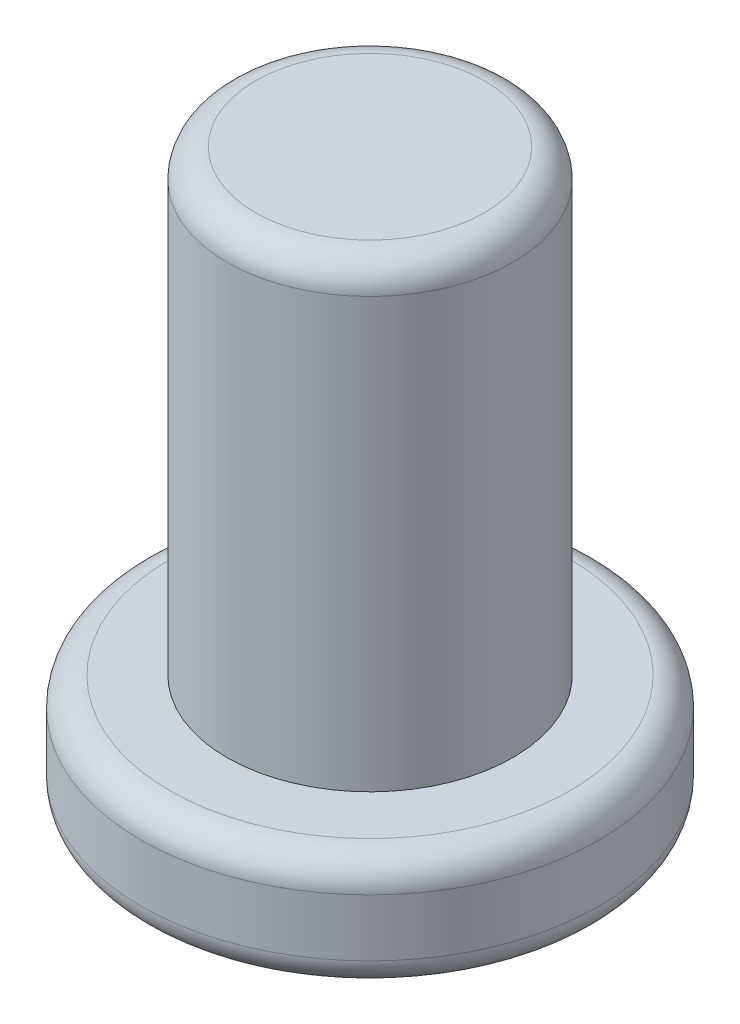
ISO-10303-21;
HEADER;
FILE_DESCRIPTION(('STEP AP214'),'2;1');
FILE_NAME('part.step','',(''),(''),'','','');
FILE_SCHEMA(('AUTOMOTIVE_DESIGN { 1 0 10303 214 1 1 1 1 }'));
ENDSEC;
DATA;
#1=APPLICATION_CONTEXT('core data for automotive mechanical design processes');
#2=APPLICATION_PROTOCOL_DEFINITION('international standard','automotive_design',2000,#1);
#3=PRODUCT_CONTEXT('',#1,'mechanical');
#4=PRODUCT('Part','Part','',(#3));
#5=PRODUCT_RELATED_PRODUCT_CATEGORY('part','',(#4));
#6=PRODUCT_DEFINITION_FORMATION('','',#4);
#7=PRODUCT_DEFINITION_CONTEXT('part definition',#1,'design');
#8=PRODUCT_DEFINITION('design','',#6,#7);
#9=PRODUCT_DEFINITION_SHAPE('','',#8);
#10=(LENGTH_UNIT() NAMED_UNIT(*) SI_UNIT(.MILLI.,.METRE.));
#11=(NAMED_UNIT(*) PLANE_ANGLE_UNIT() SI_UNIT($,.RADIAN.));
#12=(NAMED_UNIT(*) SI_UNIT($,.STERADIAN.) SOLID_ANGLE_UNIT());
#13=UNCERTAINTY_MEASURE_WITH_UNIT(LENGTH_MEASURE(1.E-05),#10,'distance_accuracy_value','');
#14=(GEOMETRIC_REPRESENTATION_CONTEXT(3) GLOBAL_UNCERTAINTY_ASSIGNED_CONTEXT((#13)) GLOBAL_UNIT_ASSIGNED_CONTEXT((#10,
#11,#12)) REPRESENTATION_CONTEXT('',''));
#15=CARTESIAN_POINT('',(0.,0.,0.));
#16=DIRECTION('',(0.,0.,1.));
#17=DIRECTION('',(1.,0.,0.));
#18=AXIS2_PLACEMENT_3D('',#15,#16,#17);
#19=CARTESIAN_POINT('',(0.,2.,0.));
#20=DIRECTION('',(0.,-1.,0.));
#21=DIRECTION('',(0.,0.,-1.));
#22=AXIS2_PLACEMENT_3D('',#19,#20,#21);
#23=CYLINDRICAL_SURFACE('',#22,4.);
#24=CARTESIAN_POINT('',(0.,1.5,0.));
#25=DIRECTION('',(0.,1.,0.));
#26=DIRECTION('',(0.,0.,1.));
#27=AXIS2_PLACEMENT_3D('',#24,#25,#26);
#28=CIRCLE('',#27,4.);
#29=CARTESIAN_POINT('',(0.,1.5,4.));
#30=VERTEX_POINT('',#29);
#31=EDGE_CURVE('E44',#30,#30,#28,.F.);
#32=ORIENTED_EDGE('',*,*,#31,.T.);
#33=EDGE_LOOP('',(#32));
#34=FACE_BOUND('',#33,.T.);
#35=CARTESIAN_POINT('',(0.,0.5,0.));
#36=DIRECTION('',(0.,1.,0.));
#37=DIRECTION('',(0.,0.,1.));
#38=AXIS2_PLACEMENT_3D('',#35,#36,#37);
#39=CIRCLE('',#38,4.);
#40=CARTESIAN_POINT('',(0.,0.5,4.));
#41=VERTEX_POINT('',#40);
#42=EDGE_CURVE('E56',#41,#41,#39,.T.);
#43=ORIENTED_EDGE('',*,*,#42,.T.);
#44=EDGE_LOOP('',(#43));
#45=FACE_BOUND('',#44,.T.);
#46=ADVANCED_FACE('F33',(#34,#45),#23,.T.);
#47=CARTESIAN_POINT('',(0.,2.,0.));
#48=DIRECTION('',(0.,1.,0.));
#49=DIRECTION('',(0.,0.,1.));
#50=AXIS2_PLACEMENT_3D('',#47,#48,#49);
#51=PLANE('',#50);
#52=CARTESIAN_POINT('',(0.,2.,0.));
#53=DIRECTION('',(0.,1.,0.));
#54=DIRECTION('',(0.,0.,1.));
#55=AXIS2_PLACEMENT_3D('',#52,#53,#54);
#56=CIRCLE('',#55,3.5);
#57=CARTESIAN_POINT('',(0.,2.,3.5));
#58=VERTEX_POINT('',#57);
#59=EDGE_CURVE('E48',#58,#58,#56,.T.);
#60=ORIENTED_EDGE('',*,*,#59,.T.);
#61=EDGE_LOOP('',(#60));
#62=FACE_BOUND('',#61,.T.);
#63=CARTESIAN_POINT('',(0.,2.,0.));
#64=DIRECTION('',(0.,1.,0.));
#65=DIRECTION('',(0.,0.,1.));
#66=AXIS2_PLACEMENT_3D('',#63,#64,#65);
#67=CIRCLE('',#66,2.5);
#68=CARTESIAN_POINT('',(0.,2.,2.5));
#69=VERTEX_POINT('',#68);
#70=EDGE_CURVE('E59',#69,#69,#67,.T.);
#71=ORIENTED_EDGE('',*,*,#70,.F.);
#72=EDGE_LOOP('',(#71));
#73=FACE_BOUND('',#72,.T.);
#74=ADVANCED_FACE('F65',(#62,#73),#51,.T.);
#75=CARTESIAN_POINT('',(0.,0.,0.));
#76=DIRECTION('',(0.,1.,0.));
#77=DIRECTION('',(0.,0.,1.));
#78=AXIS2_PLACEMENT_3D('',#75,#76,#77);
#79=PLANE('',#78);
#80=CARTESIAN_POINT('',(0.,0.,0.));
#81=DIRECTION('',(0.,1.,0.));
#82=DIRECTION('',(0.,0.,1.));
#83=AXIS2_PLACEMENT_3D('',#80,#81,#82);
#84=CIRCLE('',#83,3.5);
#85=CARTESIAN_POINT('',(0.,0.,3.5));
#86=VERTEX_POINT('',#85);
#87=EDGE_CURVE('E53',#86,#86,#84,.F.);
#88=ORIENTED_EDGE('',*,*,#87,.T.);
#89=EDGE_LOOP('',(#88));
#90=FACE_BOUND('',#89,.T.);
#91=ADVANCED_FACE('F67',(#90),#79,.F.);
#92=CARTESIAN_POINT('',(0.,10.,0.));
#93=DIRECTION('',(0.,-1.,0.));
#94=DIRECTION('',(0.,0.,-1.));
#95=AXIS2_PLACEMENT_3D('',#92,#93,#94);
#96=CYLINDRICAL_SURFACE('',#95,2.5);
#97=CARTESIAN_POINT('',(0.,9.5,0.));
#98=DIRECTION('',(0.,1.,0.));
#99=DIRECTION('',(0.,0.,1.));
#100=AXIS2_PLACEMENT_3D('',#97,#98,#99);
#101=CIRCLE('',#100,2.5);
#102=CARTESIAN_POINT('',(0.,9.5,2.5));
#103=VERTEX_POINT('',#102);
#104=EDGE_CURVE('E10',#103,#103,#101,.F.);
#105=ORIENTED_EDGE('',*,*,#104,.T.);
#106=EDGE_LOOP('',(#105));
#107=FACE_BOUND('',#106,.T.);
#108=ORIENTED_EDGE('',*,*,#70,.T.);
#109=EDGE_LOOP('',(#108));
#110=FACE_BOUND('',#109,.T.);
#111=ADVANCED_FACE('F63',(#107,#110),#96,.T.);
#112=CARTESIAN_POINT('',(0.,10.,0.));
#113=DIRECTION('',(0.,1.,0.));
#114=DIRECTION('',(0.,0.,1.));
#115=AXIS2_PLACEMENT_3D('',#112,#113,#114);
#116=PLANE('',#115);
#117=CARTESIAN_POINT('',(0.,10.,0.));
#118=DIRECTION('',(0.,1.,0.));
#119=DIRECTION('',(0.,0.,1.));
#120=AXIS2_PLACEMENT_3D('',#117,#118,#119);
#121=CIRCLE('',#120,2.);
#122=CARTESIAN_POINT('',(0.,10.,2.));
#123=VERTEX_POINT('',#122);
#124=EDGE_CURVE('E40',#123,#123,#121,.T.);
#125=ORIENTED_EDGE('',*,*,#124,.T.);
#126=EDGE_LOOP('',(#125));
#127=FACE_BOUND('',#126,.T.);
#128=ADVANCED_FACE('F84',(#127),#116,.T.);
#129=CARTESIAN_POINT('',(0.,0.5,0.));
#130=DIRECTION('',(0.,1.,0.));
#131=DIRECTION('',(0.,0.,1.));
#132=AXIS2_PLACEMENT_3D('',#129,#130,#131);
#133=TOROIDAL_SURFACE('',#132,3.5,0.5);
#134=ORIENTED_EDGE('',*,*,#87,.F.);
#135=EDGE_LOOP('',(#134));
#136=FACE_BOUND('',#135,.T.);
#137=ORIENTED_EDGE('',*,*,#42,.F.);
#138=EDGE_LOOP('',(#137));
#139=FACE_BOUND('',#138,.T.);
#140=ADVANCED_FACE('F81',(#136,#139),#133,.T.);
#141=CARTESIAN_POINT('',(0.,1.5,0.));
#142=DIRECTION('',(0.,1.,0.));
#143=DIRECTION('',(0.,0.,1.));
#144=AXIS2_PLACEMENT_3D('',#141,#142,#143);
#145=TOROIDAL_SURFACE('',#144,3.5,0.5);
#146=ORIENTED_EDGE('',*,*,#31,.F.);
#147=EDGE_LOOP('',(#146));
#148=FACE_BOUND('',#147,.T.);
#149=ORIENTED_EDGE('',*,*,#59,.F.);
#150=EDGE_LOOP('',(#149));
#151=FACE_BOUND('',#150,.T.);
#152=ADVANCED_FACE('F83',(#148,#151),#145,.T.);
#153=CARTESIAN_POINT('',(0.,9.5,0.));
#154=DIRECTION('',(0.,1.,0.));
#155=DIRECTION('',(0.,0.,1.));
#156=AXIS2_PLACEMENT_3D('',#153,#154,#155);
#157=TOROIDAL_SURFACE('',#156,2.,0.5);
#158=ORIENTED_EDGE('',*,*,#104,.F.);
#159=EDGE_LOOP('',(#158));
#160=FACE_BOUND('',#159,.T.);
#161=ORIENTED_EDGE('',*,*,#124,.F.);
#162=EDGE_LOOP('',(#161));
#163=FACE_BOUND('',#162,.T.);
#164=ADVANCED_FACE('F35',(#160,#163),#157,.T.);
#165=CLOSED_SHELL('',(#46,#74,#91,#111,#128,#140,#152,#164));
#166=MANIFOLD_SOLID_BREP('B2',#165);
#167=ADVANCED_BREP_SHAPE_REPRESENTATION('',(#18,#166),#14);
#168=SHAPE_DEFINITION_REPRESENTATION(#9,#167);
ENDSEC;
END-ISO-10303-21;
